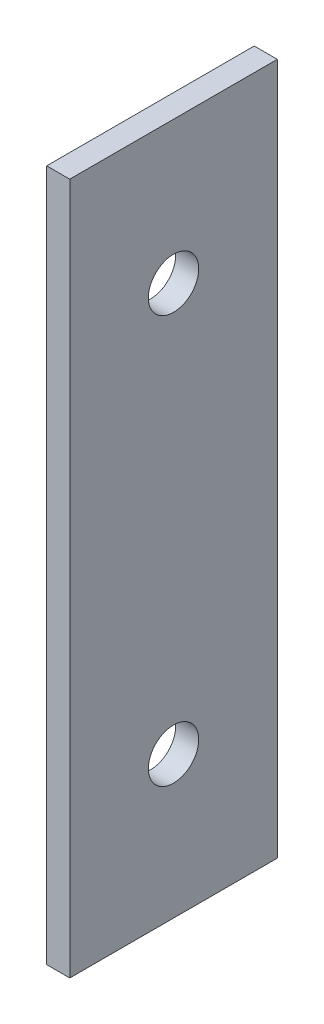
ISO-10303-21;
HEADER;
FILE_DESCRIPTION(('STEP AP214'),'2;1');
FILE_NAME('part.step','',(''),(''),'','','');
FILE_SCHEMA(('AUTOMOTIVE_DESIGN { 1 0 10303 214 1 1 1 1 }'));
ENDSEC;
DATA;
#1=APPLICATION_CONTEXT('core data for automotive mechanical design processes');
#2=APPLICATION_PROTOCOL_DEFINITION('international standard','automotive_design',2000,#1);
#3=PRODUCT_CONTEXT('',#1,'mechanical');
#4=PRODUCT('Part','Part','',(#3));
#5=PRODUCT_RELATED_PRODUCT_CATEGORY('part','',(#4));
#6=PRODUCT_DEFINITION_FORMATION('','',#4);
#7=PRODUCT_DEFINITION_CONTEXT('part definition',#1,'design');
#8=PRODUCT_DEFINITION('design','',#6,#7);
#9=PRODUCT_DEFINITION_SHAPE('','',#8);
#10=(LENGTH_UNIT() NAMED_UNIT(*) SI_UNIT(.MILLI.,.METRE.));
#11=(NAMED_UNIT(*) PLANE_ANGLE_UNIT() SI_UNIT($,.RADIAN.));
#12=(NAMED_UNIT(*) SI_UNIT($,.STERADIAN.) SOLID_ANGLE_UNIT());
#13=UNCERTAINTY_MEASURE_WITH_UNIT(LENGTH_MEASURE(1.E-05),#10,'distance_accuracy_value','');
#14=(GEOMETRIC_REPRESENTATION_CONTEXT(3) GLOBAL_UNCERTAINTY_ASSIGNED_CONTEXT((#13)) GLOBAL_UNIT_ASSIGNED_CONTEXT((#10,
#11,#12)) REPRESENTATION_CONTEXT('',''));
#15=CARTESIAN_POINT('',(0.,0.,0.));
#16=DIRECTION('',(0.,0.,1.));
#17=DIRECTION('',(1.,0.,0.));
#18=AXIS2_PLACEMENT_3D('',#15,#16,#17);
#19=CARTESIAN_POINT('',(3.12924372930912,0.,9.));
#20=DIRECTION('',(1.,0.,0.));
#21=DIRECTION('',(0.,1.,0.));
#22=AXIS2_PLACEMENT_3D('',#19,#20,#21);
#23=PLANE('',#22);
#24=CARTESIAN_POINT('',(3.12924372930912,-16.7824699599649,4.5));
#25=DIRECTION('',(1.,0.,0.));
#26=DIRECTION('',(0.,-1.,0.));
#27=AXIS2_PLACEMENT_3D('',#24,#25,#26);
#28=CIRCLE('',#27,1.0922);
#29=CARTESIAN_POINT('',(3.12924372930912,-17.8746699599649,4.5));
#30=VERTEX_POINT('',#29);
#31=EDGE_CURVE('E121',#30,#30,#28,.T.);
#32=ORIENTED_EDGE('',*,*,#31,.F.);
#33=EDGE_LOOP('',(#32));
#34=FACE_BOUND('',#33,.T.);
#35=CARTESIAN_POINT('',(3.12924372930912,0.897530040035069,4.5));
#36=DIRECTION('',(1.,0.,0.));
#37=DIRECTION('',(0.,1.,0.));
#38=AXIS2_PLACEMENT_3D('',#35,#36,#37);
#39=CIRCLE('',#38,1.0922);
#40=CARTESIAN_POINT('',(3.12924372930912,1.98973004003507,4.5));
#41=VERTEX_POINT('',#40);
#42=EDGE_CURVE('E114',#41,#41,#39,.T.);
#43=ORIENTED_EDGE('',*,*,#42,.F.);
#44=EDGE_LOOP('',(#43));
#45=FACE_BOUND('',#44,.T.);
#46=DIRECTION('',(0.,-1.,0.));
#47=VECTOR('',#46,1.);
#48=CARTESIAN_POINT('',(3.12924372930912,0.,0.));
#49=LINE('',#48,#47);
#50=CARTESIAN_POINT('',(3.12924372930911,7.05753004003507,0.));
#51=VERTEX_POINT('',#50);
#52=CARTESIAN_POINT('',(3.12924372930912,-22.9424699599649,0.));
#53=VERTEX_POINT('',#52);
#54=EDGE_CURVE('E105',#51,#53,#49,.T.);
#55=ORIENTED_EDGE('',*,*,#54,.F.);
#56=DIRECTION('',(0.,0.,-1.));
#57=VECTOR('',#56,1.);
#58=CARTESIAN_POINT('',(3.12924372930911,7.05753004003507,9.));
#59=LINE('',#58,#57);
#60=CARTESIAN_POINT('',(3.12924372930911,7.05753004003507,9.));
#61=VERTEX_POINT('',#60);
#62=EDGE_CURVE('E11',#61,#51,#59,.T.);
#63=ORIENTED_EDGE('',*,*,#62,.F.);
#64=DIRECTION('',(0.,-1.,0.));
#65=VECTOR('',#64,1.);
#66=CARTESIAN_POINT('',(3.12924372930912,0.,9.));
#67=LINE('',#66,#65);
#68=CARTESIAN_POINT('',(3.12924372930912,-22.9424699599649,9.));
#69=VERTEX_POINT('',#68);
#70=EDGE_CURVE('E98',#61,#69,#67,.T.);
#71=ORIENTED_EDGE('',*,*,#70,.T.);
#72=DIRECTION('',(0.,0.,-1.));
#73=VECTOR('',#72,1.);
#74=CARTESIAN_POINT('',(3.12924372930912,-22.9424699599649,9.));
#75=LINE('',#74,#73);
#76=EDGE_CURVE('E78',#69,#53,#75,.T.);
#77=ORIENTED_EDGE('',*,*,#76,.T.);
#78=EDGE_LOOP('',(#55,#63,#71,#77));
#79=FACE_BOUND('',#78,.T.);
#80=ADVANCED_FACE('F38',(#34,#45,#79),#23,.T.);
#81=CARTESIAN_POINT('',(0.,7.05753004003507,9.));
#82=DIRECTION('',(0.,1.,0.));
#83=DIRECTION('',(0.,0.,1.));
#84=AXIS2_PLACEMENT_3D('',#81,#82,#83);
#85=PLANE('',#84);
#86=DIRECTION('',(1.,0.,0.));
#87=VECTOR('',#86,1.);
#88=CARTESIAN_POINT('',(0.,7.05753004003507,0.));
#89=LINE('',#88,#87);
#90=CARTESIAN_POINT('',(2.12924372930911,7.05753004003507,0.));
#91=VERTEX_POINT('',#90);
#92=EDGE_CURVE('E91',#91,#51,#89,.T.);
#93=ORIENTED_EDGE('',*,*,#92,.F.);
#94=DIRECTION('',(0.,0.,-1.));
#95=VECTOR('',#94,1.);
#96=CARTESIAN_POINT('',(2.12924372930911,7.05753004003507,9.));
#97=LINE('',#96,#95);
#98=CARTESIAN_POINT('',(2.12924372930911,7.05753004003507,9.));
#99=VERTEX_POINT('',#98);
#100=EDGE_CURVE('E47',#99,#91,#97,.T.);
#101=ORIENTED_EDGE('',*,*,#100,.F.);
#102=DIRECTION('',(1.,0.,0.));
#103=VECTOR('',#102,1.);
#104=CARTESIAN_POINT('',(0.,7.05753004003507,9.));
#105=LINE('',#104,#103);
#106=EDGE_CURVE('E89',#99,#61,#105,.T.);
#107=ORIENTED_EDGE('',*,*,#106,.T.);
#108=ORIENTED_EDGE('',*,*,#62,.T.);
#109=EDGE_LOOP('',(#93,#101,#107,#108));
#110=FACE_BOUND('',#109,.T.);
#111=ADVANCED_FACE('F87',(#110),#85,.T.);
#112=CARTESIAN_POINT('',(2.12924372930912,0.,9.));
#113=DIRECTION('',(1.,0.,0.));
#114=DIRECTION('',(0.,1.,0.));
#115=AXIS2_PLACEMENT_3D('',#112,#113,#114);
#116=PLANE('',#115);
#117=CARTESIAN_POINT('',(2.12924372930912,-16.7824699599649,4.5));
#118=DIRECTION('',(1.,0.,0.));
#119=DIRECTION('',(0.,1.,0.));
#120=AXIS2_PLACEMENT_3D('',#117,#118,#119);
#121=CIRCLE('',#120,1.0922);
#122=CARTESIAN_POINT('',(2.12924372930912,-15.6902699599649,4.5));
#123=VERTEX_POINT('',#122);
#124=EDGE_CURVE('E41',#123,#123,#121,.T.);
#125=ORIENTED_EDGE('',*,*,#124,.T.);
#126=EDGE_LOOP('',(#125));
#127=FACE_BOUND('',#126,.T.);
#128=CARTESIAN_POINT('',(2.12924372930912,0.897530040035069,4.5));
#129=DIRECTION('',(1.,0.,0.));
#130=DIRECTION('',(0.,1.,0.));
#131=AXIS2_PLACEMENT_3D('',#128,#129,#130);
#132=CIRCLE('',#131,1.0922);
#133=CARTESIAN_POINT('',(2.12924372930912,1.98973004003507,4.5));
#134=VERTEX_POINT('',#133);
#135=EDGE_CURVE('E108',#134,#134,#132,.T.);
#136=ORIENTED_EDGE('',*,*,#135,.T.);
#137=EDGE_LOOP('',(#136));
#138=FACE_BOUND('',#137,.T.);
#139=DIRECTION('',(0.,-1.,0.));
#140=VECTOR('',#139,1.);
#141=CARTESIAN_POINT('',(2.12924372930912,0.,0.));
#142=LINE('',#141,#140);
#143=CARTESIAN_POINT('',(2.12924372930912,-22.9424699599649,0.));
#144=VERTEX_POINT('',#143);
#145=EDGE_CURVE('E71',#91,#144,#142,.T.);
#146=ORIENTED_EDGE('',*,*,#145,.T.);
#147=DIRECTION('',(0.,0.,-1.));
#148=VECTOR('',#147,1.);
#149=CARTESIAN_POINT('',(2.12924372930912,-22.9424699599649,9.));
#150=LINE('',#149,#148);
#151=CARTESIAN_POINT('',(2.12924372930912,-22.9424699599649,9.));
#152=VERTEX_POINT('',#151);
#153=EDGE_CURVE('E92',#152,#144,#150,.T.);
#154=ORIENTED_EDGE('',*,*,#153,.F.);
#155=DIRECTION('',(0.,-1.,0.));
#156=VECTOR('',#155,1.);
#157=CARTESIAN_POINT('',(2.12924372930912,0.,9.));
#158=LINE('',#157,#156);
#159=EDGE_CURVE('E94',#99,#152,#158,.T.);
#160=ORIENTED_EDGE('',*,*,#159,.F.);
#161=ORIENTED_EDGE('',*,*,#100,.T.);
#162=EDGE_LOOP('',(#146,#154,#160,#161));
#163=FACE_BOUND('',#162,.T.);
#164=ADVANCED_FACE('F95',(#127,#138,#163),#116,.F.);
#165=CARTESIAN_POINT('',(0.,-22.9424699599649,9.));
#166=DIRECTION('',(0.,1.,0.));
#167=DIRECTION('',(0.,0.,1.));
#168=AXIS2_PLACEMENT_3D('',#165,#166,#167);
#169=PLANE('',#168);
#170=DIRECTION('',(1.,0.,0.));
#171=VECTOR('',#170,1.);
#172=CARTESIAN_POINT('',(0.,-22.9424699599649,0.));
#173=LINE('',#172,#171);
#174=EDGE_CURVE('E100',#144,#53,#173,.T.);
#175=ORIENTED_EDGE('',*,*,#174,.T.);
#176=ORIENTED_EDGE('',*,*,#76,.F.);
#177=DIRECTION('',(1.,0.,0.));
#178=VECTOR('',#177,1.);
#179=CARTESIAN_POINT('',(0.,-22.9424699599649,9.));
#180=LINE('',#179,#178);
#181=EDGE_CURVE('E56',#152,#69,#180,.T.);
#182=ORIENTED_EDGE('',*,*,#181,.F.);
#183=ORIENTED_EDGE('',*,*,#153,.T.);
#184=EDGE_LOOP('',(#175,#176,#182,#183));
#185=FACE_BOUND('',#184,.T.);
#186=ADVANCED_FACE('F135',(#185),#169,.F.);
#187=CARTESIAN_POINT('',(0.,0.,9.));
#188=DIRECTION('',(0.,0.,1.));
#189=DIRECTION('',(1.,0.,0.));
#190=AXIS2_PLACEMENT_3D('',#187,#188,#189);
#191=PLANE('',#190);
#192=ORIENTED_EDGE('',*,*,#70,.F.);
#193=ORIENTED_EDGE('',*,*,#106,.F.);
#194=ORIENTED_EDGE('',*,*,#159,.T.);
#195=ORIENTED_EDGE('',*,*,#181,.T.);
#196=EDGE_LOOP('',(#192,#193,#194,#195));
#197=FACE_BOUND('',#196,.T.);
#198=ADVANCED_FACE('F97',(#197),#191,.T.);
#199=CARTESIAN_POINT('',(0.,0.,0.));
#200=DIRECTION('',(0.,0.,1.));
#201=DIRECTION('',(1.,0.,0.));
#202=AXIS2_PLACEMENT_3D('',#199,#200,#201);
#203=PLANE('',#202);
#204=ORIENTED_EDGE('',*,*,#54,.T.);
#205=ORIENTED_EDGE('',*,*,#174,.F.);
#206=ORIENTED_EDGE('',*,*,#145,.F.);
#207=ORIENTED_EDGE('',*,*,#92,.T.);
#208=EDGE_LOOP('',(#204,#205,#206,#207));
#209=FACE_BOUND('',#208,.T.);
#210=ADVANCED_FACE('F133',(#209),#203,.F.);
#211=CARTESIAN_POINT('',(-6.87075627069088,0.897530040035068,4.5));
#212=DIRECTION('',(1.,0.,0.));
#213=DIRECTION('',(0.,1.,0.));
#214=AXIS2_PLACEMENT_3D('',#211,#212,#213);
#215=CYLINDRICAL_SURFACE('',#214,1.0922);
#216=ORIENTED_EDGE('',*,*,#42,.T.);
#217=EDGE_LOOP('',(#216));
#218=FACE_BOUND('',#217,.T.);
#219=ORIENTED_EDGE('',*,*,#135,.F.);
#220=EDGE_LOOP('',(#219));
#221=FACE_BOUND('',#220,.T.);
#222=ADVANCED_FACE('F164',(#218,#221),#215,.F.);
#223=CARTESIAN_POINT('',(-6.87075627069088,-16.7824699599649,4.5));
#224=DIRECTION('',(1.,0.,0.));
#225=DIRECTION('',(0.,1.,0.));
#226=AXIS2_PLACEMENT_3D('',#223,#224,#225);
#227=CYLINDRICAL_SURFACE('',#226,1.0922);
#228=ORIENTED_EDGE('',*,*,#31,.T.);
#229=EDGE_LOOP('',(#228));
#230=FACE_BOUND('',#229,.T.);
#231=ORIENTED_EDGE('',*,*,#124,.F.);
#232=EDGE_LOOP('',(#231));
#233=FACE_BOUND('',#232,.T.);
#234=ADVANCED_FACE('F126',(#230,#233),#227,.F.);
#235=CLOSED_SHELL('',(#80,#111,#164,#186,#198,#210,#222,#234));
#236=MANIFOLD_SOLID_BREP('B2',#235);
#237=ADVANCED_BREP_SHAPE_REPRESENTATION('',(#18,#236),#14);
#238=SHAPE_DEFINITION_REPRESENTATION(#9,#237);
ENDSEC;
END-ISO-10303-21;
